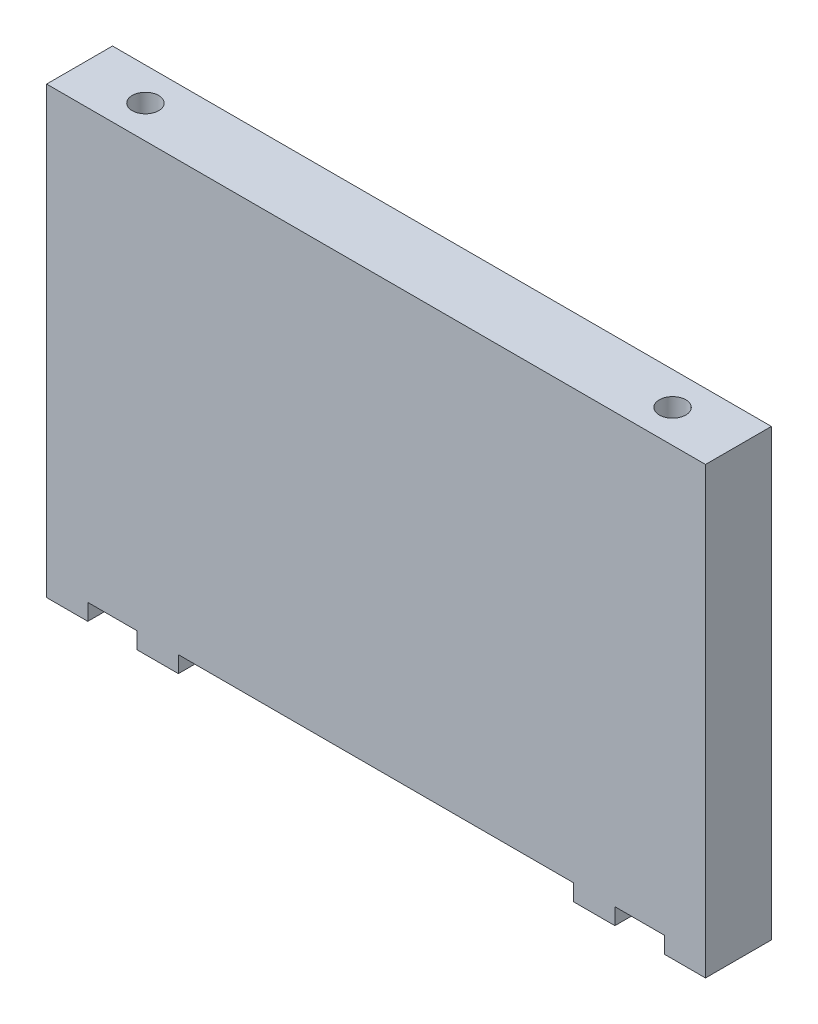
ISO-10303-21;
HEADER;
FILE_DESCRIPTION(('STEP AP214'),'2;1');
FILE_NAME('part.step','',(''),(''),'','','');
FILE_SCHEMA(('AUTOMOTIVE_DESIGN { 1 0 10303 214 1 1 1 1 }'));
ENDSEC;
DATA;
#1=APPLICATION_CONTEXT('core data for automotive mechanical design processes');
#2=APPLICATION_PROTOCOL_DEFINITION('international standard','automotive_design',2000,#1);
#3=PRODUCT_CONTEXT('',#1,'mechanical');
#4=PRODUCT('Part','Part','',(#3));
#5=PRODUCT_RELATED_PRODUCT_CATEGORY('part','',(#4));
#6=PRODUCT_DEFINITION_FORMATION('','',#4);
#7=PRODUCT_DEFINITION_CONTEXT('part definition',#1,'design');
#8=PRODUCT_DEFINITION('design','',#6,#7);
#9=PRODUCT_DEFINITION_SHAPE('','',#8);
#10=(LENGTH_UNIT() NAMED_UNIT(*) SI_UNIT(.MILLI.,.METRE.));
#11=(NAMED_UNIT(*) PLANE_ANGLE_UNIT() SI_UNIT($,.RADIAN.));
#12=(NAMED_UNIT(*) SI_UNIT($,.STERADIAN.) SOLID_ANGLE_UNIT());
#13=UNCERTAINTY_MEASURE_WITH_UNIT(LENGTH_MEASURE(1.E-05),#10,'distance_accuracy_value','');
#14=(GEOMETRIC_REPRESENTATION_CONTEXT(3) GLOBAL_UNCERTAINTY_ASSIGNED_CONTEXT((#13)) GLOBAL_UNIT_ASSIGNED_CONTEXT((#10,
#11,#12)) REPRESENTATION_CONTEXT('',''));
#15=CARTESIAN_POINT('',(0.,0.,0.));
#16=DIRECTION('',(0.,0.,1.));
#17=DIRECTION('',(1.,0.,0.));
#18=AXIS2_PLACEMENT_3D('',#15,#16,#17);
#19=CARTESIAN_POINT('',(-63.5,-42.8625,12.7));
#20=DIRECTION('',(0.,1.,0.));
#21=DIRECTION('',(0.,0.,1.));
#22=AXIS2_PLACEMENT_3D('',#19,#20,#21);
#23=PLANE('',#22);
#24=DIRECTION('',(1.,0.,0.));
#25=VECTOR('',#24,1.);
#26=CARTESIAN_POINT('',(-63.5,-42.8625,0.));
#27=LINE('',#26,#25);
#28=CARTESIAN_POINT('',(-63.5,-42.8625,0.));
#29=VERTEX_POINT('',#28);
#30=CARTESIAN_POINT('',(-55.5625,-42.8625,0.));
#31=VERTEX_POINT('',#30);
#32=EDGE_CURVE('E302',#29,#31,#27,.T.);
#33=ORIENTED_EDGE('',*,*,#32,.T.);
#34=DIRECTION('',(0.,0.,1.));
#35=VECTOR('',#34,1.);
#36=CARTESIAN_POINT('',(-55.5625,-42.8625,0.));
#37=LINE('',#36,#35);
#38=CARTESIAN_POINT('',(-55.5625,-42.8625,12.7));
#39=VERTEX_POINT('',#38);
#40=EDGE_CURVE('E214',#31,#39,#37,.T.);
#41=ORIENTED_EDGE('',*,*,#40,.T.);
#42=DIRECTION('',(1.,0.,0.));
#43=VECTOR('',#42,1.);
#44=CARTESIAN_POINT('',(-63.5,-42.8625,12.7));
#45=LINE('',#44,#43);
#46=CARTESIAN_POINT('',(-63.5,-42.8625,12.7));
#47=VERTEX_POINT('',#46);
#48=EDGE_CURVE('E289',#47,#39,#45,.T.);
#49=ORIENTED_EDGE('',*,*,#48,.F.);
#50=DIRECTION('',(0.,0.,-1.));
#51=VECTOR('',#50,1.);
#52=CARTESIAN_POINT('',(-63.5,-42.8625,12.7));
#53=LINE('',#52,#51);
#54=EDGE_CURVE('E57',#47,#29,#53,.T.);
#55=ORIENTED_EDGE('',*,*,#54,.T.);
#56=EDGE_LOOP('',(#33,#41,#49,#55));
#57=FACE_BOUND('',#56,.T.);
#58=ADVANCED_FACE('F48',(#57),#23,.F.);
#59=CARTESIAN_POINT('',(38.0999999999999,-42.8625,0.));
#60=VERTEX_POINT('',#59);
#61=CARTESIAN_POINT('',(46.0375,-42.8625,0.));
#62=VERTEX_POINT('',#61);
#63=EDGE_CURVE('E306',#60,#62,#27,.T.);
#64=ORIENTED_EDGE('',*,*,#63,.T.);
#65=DIRECTION('',(0.,0.,1.));
#66=VECTOR('',#65,1.);
#67=CARTESIAN_POINT('',(46.0375,-42.8625,0.));
#68=LINE('',#67,#66);
#69=CARTESIAN_POINT('',(46.0375,-42.8625,12.7));
#70=VERTEX_POINT('',#69);
#71=EDGE_CURVE('E238',#62,#70,#68,.T.);
#72=ORIENTED_EDGE('',*,*,#71,.T.);
#73=CARTESIAN_POINT('',(38.0999999999999,-42.8625,12.7));
#74=VERTEX_POINT('',#73);
#75=EDGE_CURVE('E294',#74,#70,#45,.T.);
#76=ORIENTED_EDGE('',*,*,#75,.F.);
#77=DIRECTION('',(0.,0.,1.));
#78=VECTOR('',#77,1.);
#79=CARTESIAN_POINT('',(38.0999999999999,-42.8625,0.));
#80=LINE('',#79,#78);
#81=EDGE_CURVE('E277',#60,#74,#80,.T.);
#82=ORIENTED_EDGE('',*,*,#81,.F.);
#83=EDGE_LOOP('',(#64,#72,#76,#82));
#84=FACE_BOUND('',#83,.T.);
#85=ADVANCED_FACE('F365',(#84),#23,.F.);
#86=CARTESIAN_POINT('',(-46.0375,-42.8625,12.7));
#87=VERTEX_POINT('',#86);
#88=CARTESIAN_POINT('',(-38.0999999999999,-42.8625,12.7));
#89=VERTEX_POINT('',#88);
#90=EDGE_CURVE('E293',#87,#89,#45,.T.);
#91=ORIENTED_EDGE('',*,*,#90,.F.);
#92=DIRECTION('',(0.,0.,1.));
#93=VECTOR('',#92,1.);
#94=CARTESIAN_POINT('',(-46.0375,-42.8625,0.));
#95=LINE('',#94,#93);
#96=CARTESIAN_POINT('',(-46.0375,-42.8625,0.));
#97=VERTEX_POINT('',#96);
#98=EDGE_CURVE('E226',#97,#87,#95,.T.);
#99=ORIENTED_EDGE('',*,*,#98,.F.);
#100=CARTESIAN_POINT('',(-38.0999999999999,-42.8625,0.));
#101=VERTEX_POINT('',#100);
#102=EDGE_CURVE('E305',#97,#101,#27,.T.);
#103=ORIENTED_EDGE('',*,*,#102,.T.);
#104=DIRECTION('',(0.,0.,1.));
#105=VECTOR('',#104,1.);
#106=CARTESIAN_POINT('',(-38.0999999999999,-42.8625,0.));
#107=LINE('',#106,#105);
#108=EDGE_CURVE('E264',#101,#89,#107,.T.);
#109=ORIENTED_EDGE('',*,*,#108,.T.);
#110=EDGE_LOOP('',(#91,#99,#103,#109));
#111=FACE_BOUND('',#110,.T.);
#112=ADVANCED_FACE('F346',(#111),#23,.F.);
#113=CARTESIAN_POINT('',(-63.5,42.8625,12.7));
#114=DIRECTION('',(0.,1.,0.));
#115=DIRECTION('',(0.,0.,1.));
#116=AXIS2_PLACEMENT_3D('',#113,#114,#115);
#117=PLANE('',#116);
#118=CARTESIAN_POINT('',(-50.8,42.8625,6.34999999999999));
#119=DIRECTION('',(0.,1.,0.));
#120=DIRECTION('',(0.,0.,1.));
#121=AXIS2_PLACEMENT_3D('',#118,#119,#120);
#122=CIRCLE('',#121,2.55269999999999);
#123=CARTESIAN_POINT('',(-50.8,42.8625,8.90269999999999));
#124=VERTEX_POINT('',#123);
#125=EDGE_CURVE('E183',#124,#124,#122,.T.);
#126=ORIENTED_EDGE('',*,*,#125,.F.);
#127=EDGE_LOOP('',(#126));
#128=FACE_BOUND('',#127,.T.);
#129=CARTESIAN_POINT('',(50.8,42.8625,6.34999999999999));
#130=DIRECTION('',(0.,1.,0.));
#131=DIRECTION('',(0.,0.,1.));
#132=AXIS2_PLACEMENT_3D('',#129,#130,#131);
#133=CIRCLE('',#132,2.55269999999999);
#134=CARTESIAN_POINT('',(50.8,42.8625,8.90269999999999));
#135=VERTEX_POINT('',#134);
#136=EDGE_CURVE('E182',#135,#135,#133,.T.);
#137=ORIENTED_EDGE('',*,*,#136,.F.);
#138=EDGE_LOOP('',(#137));
#139=FACE_BOUND('',#138,.T.);
#140=DIRECTION('',(1.,0.,0.));
#141=VECTOR('',#140,1.);
#142=CARTESIAN_POINT('',(-63.5,42.8625,0.));
#143=LINE('',#142,#141);
#144=CARTESIAN_POINT('',(-63.5,42.8625,0.));
#145=VERTEX_POINT('',#144);
#146=CARTESIAN_POINT('',(63.5,42.8625,0.));
#147=VERTEX_POINT('',#146);
#148=EDGE_CURVE('E274',#145,#147,#143,.T.);
#149=ORIENTED_EDGE('',*,*,#148,.F.);
#150=DIRECTION('',(0.,0.,-1.));
#151=VECTOR('',#150,1.);
#152=CARTESIAN_POINT('',(-63.5,42.8625,12.7));
#153=LINE('',#152,#151);
#154=CARTESIAN_POINT('',(-63.5,42.8625,12.7));
#155=VERTEX_POINT('',#154);
#156=EDGE_CURVE('E13',#155,#145,#153,.T.);
#157=ORIENTED_EDGE('',*,*,#156,.F.);
#158=DIRECTION('',(1.,0.,0.));
#159=VECTOR('',#158,1.);
#160=CARTESIAN_POINT('',(-63.5,42.8625,12.7));
#161=LINE('',#160,#159);
#162=CARTESIAN_POINT('',(63.5,42.8625,12.7));
#163=VERTEX_POINT('',#162);
#164=EDGE_CURVE('E281',#155,#163,#161,.T.);
#165=ORIENTED_EDGE('',*,*,#164,.T.);
#166=DIRECTION('',(0.,0.,-1.));
#167=VECTOR('',#166,1.);
#168=CARTESIAN_POINT('',(63.5,42.8625,12.7));
#169=LINE('',#168,#167);
#170=EDGE_CURVE('E52',#163,#147,#169,.T.);
#171=ORIENTED_EDGE('',*,*,#170,.T.);
#172=EDGE_LOOP('',(#149,#157,#165,#171));
#173=FACE_BOUND('',#172,.T.);
#174=ADVANCED_FACE('F50',(#128,#139,#173),#117,.T.);
#175=CARTESIAN_POINT('',(-63.5,42.8625,12.7));
#176=DIRECTION('',(1.,0.,0.));
#177=DIRECTION('',(0.,0.,-1.));
#178=AXIS2_PLACEMENT_3D('',#175,#176,#177);
#179=PLANE('',#178);
#180=DIRECTION('',(0.,-1.,0.));
#181=VECTOR('',#180,1.);
#182=CARTESIAN_POINT('',(-63.5,42.8625,0.));
#183=LINE('',#182,#181);
#184=EDGE_CURVE('E285',#145,#29,#183,.T.);
#185=ORIENTED_EDGE('',*,*,#184,.T.);
#186=ORIENTED_EDGE('',*,*,#54,.F.);
#187=DIRECTION('',(0.,-1.,0.));
#188=VECTOR('',#187,1.);
#189=CARTESIAN_POINT('',(-63.5,42.8625,12.7));
#190=LINE('',#189,#188);
#191=EDGE_CURVE('E292',#155,#47,#190,.T.);
#192=ORIENTED_EDGE('',*,*,#191,.F.);
#193=ORIENTED_EDGE('',*,*,#156,.T.);
#194=EDGE_LOOP('',(#185,#186,#192,#193));
#195=FACE_BOUND('',#194,.T.);
#196=ADVANCED_FACE('F326',(#195),#179,.F.);
#197=CARTESIAN_POINT('',(55.5625,-42.8625,12.7));
#198=VERTEX_POINT('',#197);
#199=CARTESIAN_POINT('',(63.5,-42.8625,12.7));
#200=VERTEX_POINT('',#199);
#201=EDGE_CURVE('E288',#198,#200,#45,.T.);
#202=ORIENTED_EDGE('',*,*,#201,.F.);
#203=DIRECTION('',(0.,0.,1.));
#204=VECTOR('',#203,1.);
#205=CARTESIAN_POINT('',(55.5625,-42.8625,0.));
#206=LINE('',#205,#204);
#207=CARTESIAN_POINT('',(55.5625,-42.8625,0.));
#208=VERTEX_POINT('',#207);
#209=EDGE_CURVE('E250',#208,#198,#206,.T.);
#210=ORIENTED_EDGE('',*,*,#209,.F.);
#211=CARTESIAN_POINT('',(63.5,-42.8625,0.));
#212=VERTEX_POINT('',#211);
#213=EDGE_CURVE('E301',#208,#212,#27,.T.);
#214=ORIENTED_EDGE('',*,*,#213,.T.);
#215=DIRECTION('',(0.,0.,-1.));
#216=VECTOR('',#215,1.);
#217=CARTESIAN_POINT('',(63.5,-42.8625,12.7));
#218=LINE('',#217,#216);
#219=EDGE_CURVE('E309',#200,#212,#218,.T.);
#220=ORIENTED_EDGE('',*,*,#219,.F.);
#221=EDGE_LOOP('',(#202,#210,#214,#220));
#222=FACE_BOUND('',#221,.T.);
#223=ADVANCED_FACE('F339',(#222),#23,.F.);
#224=CARTESIAN_POINT('',(63.5,42.8625,12.7));
#225=DIRECTION('',(1.,0.,0.));
#226=DIRECTION('',(0.,1.,0.));
#227=AXIS2_PLACEMENT_3D('',#224,#225,#226);
#228=PLANE('',#227);
#229=DIRECTION('',(0.,-1.,0.));
#230=VECTOR('',#229,1.);
#231=CARTESIAN_POINT('',(63.5,42.8625,0.));
#232=LINE('',#231,#230);
#233=EDGE_CURVE('E298',#147,#212,#232,.T.);
#234=ORIENTED_EDGE('',*,*,#233,.F.);
#235=ORIENTED_EDGE('',*,*,#170,.F.);
#236=DIRECTION('',(0.,-1.,0.));
#237=VECTOR('',#236,1.);
#238=CARTESIAN_POINT('',(63.5,42.8625,12.7));
#239=LINE('',#238,#237);
#240=EDGE_CURVE('E284',#163,#200,#239,.T.);
#241=ORIENTED_EDGE('',*,*,#240,.T.);
#242=ORIENTED_EDGE('',*,*,#219,.T.);
#243=EDGE_LOOP('',(#234,#235,#241,#242));
#244=FACE_BOUND('',#243,.T.);
#245=ADVANCED_FACE('F318',(#244),#228,.T.);
#246=CARTESIAN_POINT('',(0.,0.,12.7));
#247=DIRECTION('',(0.,0.,-1.));
#248=DIRECTION('',(-1.,0.,0.));
#249=AXIS2_PLACEMENT_3D('',#246,#247,#248);
#250=PLANE('',#249);
#251=ORIENTED_EDGE('',*,*,#48,.T.);
#252=DIRECTION('',(0.,-1.,0.));
#253=VECTOR('',#252,1.);
#254=CARTESIAN_POINT('',(-55.5625,-42.8625,12.7));
#255=LINE('',#254,#253);
#256=CARTESIAN_POINT('',(-55.5625,-39.6875,12.7));
#257=VERTEX_POINT('',#256);
#258=EDGE_CURVE('E205',#257,#39,#255,.T.);
#259=ORIENTED_EDGE('',*,*,#258,.F.);
#260=DIRECTION('',(-1.,0.,0.));
#261=VECTOR('',#260,1.);
#262=CARTESIAN_POINT('',(-55.5625,-39.6875,12.7));
#263=LINE('',#262,#261);
#264=CARTESIAN_POINT('',(-46.0375,-39.6875,12.7));
#265=VERTEX_POINT('',#264);
#266=EDGE_CURVE('E210',#265,#257,#263,.T.);
#267=ORIENTED_EDGE('',*,*,#266,.F.);
#268=DIRECTION('',(0.,1.,0.));
#269=VECTOR('',#268,1.);
#270=CARTESIAN_POINT('',(-46.0375,-42.8625,12.7));
#271=LINE('',#270,#269);
#272=EDGE_CURVE('E216',#87,#265,#271,.T.);
#273=ORIENTED_EDGE('',*,*,#272,.F.);
#274=ORIENTED_EDGE('',*,*,#90,.T.);
#275=DIRECTION('',(0.,-1.,0.));
#276=VECTOR('',#275,1.);
#277=CARTESIAN_POINT('',(-38.0999999999999,-42.8625,12.7));
#278=LINE('',#277,#276);
#279=CARTESIAN_POINT('',(-38.1000000000001,-39.6875,12.7));
#280=VERTEX_POINT('',#279);
#281=EDGE_CURVE('E247',#280,#89,#278,.T.);
#282=ORIENTED_EDGE('',*,*,#281,.F.);
#283=DIRECTION('',(-1.,0.,0.));
#284=VECTOR('',#283,1.);
#285=CARTESIAN_POINT('',(-38.1000000000001,-39.6875,12.7));
#286=LINE('',#285,#284);
#287=CARTESIAN_POINT('',(38.0999999999999,-39.6875,12.7));
#288=VERTEX_POINT('',#287);
#289=EDGE_CURVE('E258',#288,#280,#286,.T.);
#290=ORIENTED_EDGE('',*,*,#289,.F.);
#291=DIRECTION('',(0.,1.,0.));
#292=VECTOR('',#291,1.);
#293=CARTESIAN_POINT('',(38.0999999999999,-42.8625,12.7));
#294=LINE('',#293,#292);
#295=EDGE_CURVE('E267',#74,#288,#294,.T.);
#296=ORIENTED_EDGE('',*,*,#295,.F.);
#297=ORIENTED_EDGE('',*,*,#75,.T.);
#298=DIRECTION('',(0.,-1.,0.));
#299=VECTOR('',#298,1.);
#300=CARTESIAN_POINT('',(46.0375,-42.8625,12.7));
#301=LINE('',#300,#299);
#302=CARTESIAN_POINT('',(46.0375,-39.6875,12.7));
#303=VERTEX_POINT('',#302);
#304=EDGE_CURVE('E223',#303,#70,#301,.T.);
#305=ORIENTED_EDGE('',*,*,#304,.F.);
#306=DIRECTION('',(-1.,0.,0.));
#307=VECTOR('',#306,1.);
#308=CARTESIAN_POINT('',(46.0375,-39.6875,12.7));
#309=LINE('',#308,#307);
#310=CARTESIAN_POINT('',(55.5625,-39.6875,12.7));
#311=VERTEX_POINT('',#310);
#312=EDGE_CURVE('E234',#311,#303,#309,.T.);
#313=ORIENTED_EDGE('',*,*,#312,.F.);
#314=DIRECTION('',(0.,1.,0.));
#315=VECTOR('',#314,1.);
#316=CARTESIAN_POINT('',(55.5625,-42.8625,12.7));
#317=LINE('',#316,#315);
#318=EDGE_CURVE('E240',#198,#311,#317,.T.);
#319=ORIENTED_EDGE('',*,*,#318,.F.);
#320=ORIENTED_EDGE('',*,*,#201,.T.);
#321=ORIENTED_EDGE('',*,*,#240,.F.);
#322=ORIENTED_EDGE('',*,*,#164,.F.);
#323=ORIENTED_EDGE('',*,*,#191,.T.);
#324=EDGE_LOOP('',(#251,#259,#267,#273,#274,#282,#290,#296,#297,#305,#313,#319,#320,#321,#322,#323));
#325=FACE_BOUND('',#324,.T.);
#326=ADVANCED_FACE('F332',(#325),#250,.F.);
#327=CARTESIAN_POINT('',(0.,0.,0.));
#328=DIRECTION('',(0.,0.,-1.));
#329=DIRECTION('',(-1.,0.,0.));
#330=AXIS2_PLACEMENT_3D('',#327,#328,#329);
#331=PLANE('',#330);
#332=DIRECTION('',(0.,-1.,0.));
#333=VECTOR('',#332,1.);
#334=CARTESIAN_POINT('',(-55.5625,-42.8625,0.));
#335=LINE('',#334,#333);
#336=CARTESIAN_POINT('',(-55.5625,-39.6875,0.));
#337=VERTEX_POINT('',#336);
#338=EDGE_CURVE('E206',#337,#31,#335,.T.);
#339=ORIENTED_EDGE('',*,*,#338,.T.);
#340=ORIENTED_EDGE('',*,*,#32,.F.);
#341=ORIENTED_EDGE('',*,*,#184,.F.);
#342=ORIENTED_EDGE('',*,*,#148,.T.);
#343=ORIENTED_EDGE('',*,*,#233,.T.);
#344=ORIENTED_EDGE('',*,*,#213,.F.);
#345=DIRECTION('',(0.,1.,0.));
#346=VECTOR('',#345,1.);
#347=CARTESIAN_POINT('',(55.5625,-42.8625,0.));
#348=LINE('',#347,#346);
#349=CARTESIAN_POINT('',(55.5625,-39.6875,0.));
#350=VERTEX_POINT('',#349);
#351=EDGE_CURVE('E233',#208,#350,#348,.T.);
#352=ORIENTED_EDGE('',*,*,#351,.T.);
#353=DIRECTION('',(-1.,0.,0.));
#354=VECTOR('',#353,1.);
#355=CARTESIAN_POINT('',(46.0375,-39.6875,0.));
#356=LINE('',#355,#354);
#357=CARTESIAN_POINT('',(46.0375,-39.6875,0.));
#358=VERTEX_POINT('',#357);
#359=EDGE_CURVE('E73',#350,#358,#356,.T.);
#360=ORIENTED_EDGE('',*,*,#359,.T.);
#361=DIRECTION('',(0.,-1.,0.));
#362=VECTOR('',#361,1.);
#363=CARTESIAN_POINT('',(46.0375,-42.8625,0.));
#364=LINE('',#363,#362);
#365=EDGE_CURVE('E230',#358,#62,#364,.T.);
#366=ORIENTED_EDGE('',*,*,#365,.T.);
#367=ORIENTED_EDGE('',*,*,#63,.F.);
#368=DIRECTION('',(0.,1.,0.));
#369=VECTOR('',#368,1.);
#370=CARTESIAN_POINT('',(38.0999999999999,-42.8625,0.));
#371=LINE('',#370,#369);
#372=CARTESIAN_POINT('',(38.0999999999999,-39.6875,0.));
#373=VERTEX_POINT('',#372);
#374=EDGE_CURVE('E257',#60,#373,#371,.T.);
#375=ORIENTED_EDGE('',*,*,#374,.T.);
#376=DIRECTION('',(-1.,0.,0.));
#377=VECTOR('',#376,1.);
#378=CARTESIAN_POINT('',(-38.1000000000001,-39.6875,0.));
#379=LINE('',#378,#377);
#380=CARTESIAN_POINT('',(-38.1000000000001,-39.6875,0.));
#381=VERTEX_POINT('',#380);
#382=EDGE_CURVE('E261',#373,#381,#379,.T.);
#383=ORIENTED_EDGE('',*,*,#382,.T.);
#384=DIRECTION('',(0.,-1.,0.));
#385=VECTOR('',#384,1.);
#386=CARTESIAN_POINT('',(-38.0999999999999,-42.8625,0.));
#387=LINE('',#386,#385);
#388=EDGE_CURVE('E254',#381,#101,#387,.T.);
#389=ORIENTED_EDGE('',*,*,#388,.T.);
#390=ORIENTED_EDGE('',*,*,#102,.F.);
#391=DIRECTION('',(0.,1.,0.));
#392=VECTOR('',#391,1.);
#393=CARTESIAN_POINT('',(-46.0375,-42.8625,0.));
#394=LINE('',#393,#392);
#395=CARTESIAN_POINT('',(-46.0375,-39.6875,0.));
#396=VERTEX_POINT('',#395);
#397=EDGE_CURVE('E209',#97,#396,#394,.T.);
#398=ORIENTED_EDGE('',*,*,#397,.T.);
#399=DIRECTION('',(-1.,0.,0.));
#400=VECTOR('',#399,1.);
#401=CARTESIAN_POINT('',(-55.5625,-39.6875,0.));
#402=LINE('',#401,#400);
#403=EDGE_CURVE('E65',#396,#337,#402,.T.);
#404=ORIENTED_EDGE('',*,*,#403,.T.);
#405=EDGE_LOOP('',(#339,#340,#341,#342,#343,#344,#352,#360,#366,#367,#375,#383,#389,#390,#398,#404));
#406=FACE_BOUND('',#405,.T.);
#407=ADVANCED_FACE('F322',(#406),#331,.T.);
#408=CARTESIAN_POINT('',(-38.0999999999999,-42.8625,0.));
#409=DIRECTION('',(-1.,0.,0.));
#410=DIRECTION('',(0.,-1.,0.));
#411=AXIS2_PLACEMENT_3D('',#408,#409,#410);
#412=PLANE('',#411);
#413=ORIENTED_EDGE('',*,*,#281,.T.);
#414=ORIENTED_EDGE('',*,*,#108,.F.);
#415=ORIENTED_EDGE('',*,*,#388,.F.);
#416=DIRECTION('',(0.,0.,1.));
#417=VECTOR('',#416,1.);
#418=CARTESIAN_POINT('',(-38.1000000000001,-39.6875,0.));
#419=LINE('',#418,#417);
#420=EDGE_CURVE('E272',#381,#280,#419,.T.);
#421=ORIENTED_EDGE('',*,*,#420,.T.);
#422=EDGE_LOOP('',(#413,#414,#415,#421));
#423=FACE_BOUND('',#422,.T.);
#424=ADVANCED_FACE('F349',(#423),#412,.F.);
#425=CARTESIAN_POINT('',(-38.1000000000001,-39.6875,0.));
#426=DIRECTION('',(0.,1.,0.));
#427=DIRECTION('',(-1.,0.,0.));
#428=AXIS2_PLACEMENT_3D('',#425,#426,#427);
#429=PLANE('',#428);
#430=ORIENTED_EDGE('',*,*,#289,.T.);
#431=ORIENTED_EDGE('',*,*,#420,.F.);
#432=ORIENTED_EDGE('',*,*,#382,.F.);
#433=DIRECTION('',(0.,0.,1.));
#434=VECTOR('',#433,1.);
#435=CARTESIAN_POINT('',(38.0999999999999,-39.6875,0.));
#436=LINE('',#435,#434);
#437=EDGE_CURVE('E275',#373,#288,#436,.T.);
#438=ORIENTED_EDGE('',*,*,#437,.T.);
#439=EDGE_LOOP('',(#430,#431,#432,#438));
#440=FACE_BOUND('',#439,.T.);
#441=ADVANCED_FACE('F354',(#440),#429,.F.);
#442=CARTESIAN_POINT('',(38.0999999999999,-42.8625,0.));
#443=DIRECTION('',(1.,0.,0.));
#444=DIRECTION('',(0.,0.,-1.));
#445=AXIS2_PLACEMENT_3D('',#442,#443,#444);
#446=PLANE('',#445);
#447=ORIENTED_EDGE('',*,*,#295,.T.);
#448=ORIENTED_EDGE('',*,*,#437,.F.);
#449=ORIENTED_EDGE('',*,*,#374,.F.);
#450=ORIENTED_EDGE('',*,*,#81,.T.);
#451=EDGE_LOOP('',(#447,#448,#449,#450));
#452=FACE_BOUND('',#451,.T.);
#453=ADVANCED_FACE('F356',(#452),#446,.F.);
#454=CARTESIAN_POINT('',(46.0375,-42.8625,0.));
#455=DIRECTION('',(-1.,0.,0.));
#456=DIRECTION('',(0.,0.,1.));
#457=AXIS2_PLACEMENT_3D('',#454,#455,#456);
#458=PLANE('',#457);
#459=ORIENTED_EDGE('',*,*,#304,.T.);
#460=ORIENTED_EDGE('',*,*,#71,.F.);
#461=ORIENTED_EDGE('',*,*,#365,.F.);
#462=DIRECTION('',(0.,0.,1.));
#463=VECTOR('',#462,1.);
#464=CARTESIAN_POINT('',(46.0375,-39.6875,0.));
#465=LINE('',#464,#463);
#466=EDGE_CURVE('E245',#358,#303,#465,.T.);
#467=ORIENTED_EDGE('',*,*,#466,.T.);
#468=EDGE_LOOP('',(#459,#460,#461,#467));
#469=FACE_BOUND('',#468,.T.);
#470=ADVANCED_FACE('F368',(#469),#458,.F.);
#471=CARTESIAN_POINT('',(46.0375,-39.6875,0.));
#472=DIRECTION('',(0.,1.,0.));
#473=DIRECTION('',(0.,0.,1.));
#474=AXIS2_PLACEMENT_3D('',#471,#472,#473);
#475=PLANE('',#474);
#476=CARTESIAN_POINT('',(50.8,-39.6875,6.34999999999999));
#477=DIRECTION('',(0.,-1.,0.));
#478=DIRECTION('',(0.,0.,-1.));
#479=AXIS2_PLACEMENT_3D('',#476,#477,#478);
#480=CIRCLE('',#479,2.55269999999999);
#481=CARTESIAN_POINT('',(50.8,-39.6875,3.7973));
#482=VERTEX_POINT('',#481);
#483=EDGE_CURVE('E199',#482,#482,#480,.T.);
#484=ORIENTED_EDGE('',*,*,#483,.F.);
#485=EDGE_LOOP('',(#484));
#486=FACE_BOUND('',#485,.T.);
#487=ORIENTED_EDGE('',*,*,#312,.T.);
#488=ORIENTED_EDGE('',*,*,#466,.F.);
#489=ORIENTED_EDGE('',*,*,#359,.F.);
#490=DIRECTION('',(0.,0.,1.));
#491=VECTOR('',#490,1.);
#492=CARTESIAN_POINT('',(55.5625,-39.6875,0.));
#493=LINE('',#492,#491);
#494=EDGE_CURVE('E248',#350,#311,#493,.T.);
#495=ORIENTED_EDGE('',*,*,#494,.T.);
#496=EDGE_LOOP('',(#487,#488,#489,#495));
#497=FACE_BOUND('',#496,.T.);
#498=ADVANCED_FACE('F371',(#486,#497),#475,.F.);
#499=CARTESIAN_POINT('',(55.5625,-42.8625,0.));
#500=DIRECTION('',(1.,0.,0.));
#501=DIRECTION('',(0.,0.,-1.));
#502=AXIS2_PLACEMENT_3D('',#499,#500,#501);
#503=PLANE('',#502);
#504=ORIENTED_EDGE('',*,*,#318,.T.);
#505=ORIENTED_EDGE('',*,*,#494,.F.);
#506=ORIENTED_EDGE('',*,*,#351,.F.);
#507=ORIENTED_EDGE('',*,*,#209,.T.);
#508=EDGE_LOOP('',(#504,#505,#506,#507));
#509=FACE_BOUND('',#508,.T.);
#510=ADVANCED_FACE('F370',(#509),#503,.F.);
#511=CARTESIAN_POINT('',(-55.5625,-42.8625,0.));
#512=DIRECTION('',(-1.,0.,0.));
#513=DIRECTION('',(0.,0.,1.));
#514=AXIS2_PLACEMENT_3D('',#511,#512,#513);
#515=PLANE('',#514);
#516=ORIENTED_EDGE('',*,*,#258,.T.);
#517=ORIENTED_EDGE('',*,*,#40,.F.);
#518=ORIENTED_EDGE('',*,*,#338,.F.);
#519=DIRECTION('',(0.,0.,1.));
#520=VECTOR('',#519,1.);
#521=CARTESIAN_POINT('',(-55.5625,-39.6875,0.));
#522=LINE('',#521,#520);
#523=EDGE_CURVE('E221',#337,#257,#522,.T.);
#524=ORIENTED_EDGE('',*,*,#523,.T.);
#525=EDGE_LOOP('',(#516,#517,#518,#524));
#526=FACE_BOUND('',#525,.T.);
#527=ADVANCED_FACE('F379',(#526),#515,.F.);
#528=CARTESIAN_POINT('',(-55.5625,-39.6875,0.));
#529=DIRECTION('',(0.,1.,0.));
#530=DIRECTION('',(0.,0.,1.));
#531=AXIS2_PLACEMENT_3D('',#528,#529,#530);
#532=PLANE('',#531);
#533=CARTESIAN_POINT('',(-50.8,-39.6875,6.34999999999999));
#534=DIRECTION('',(0.,-1.,0.));
#535=DIRECTION('',(0.,0.,-1.));
#536=AXIS2_PLACEMENT_3D('',#533,#534,#535);
#537=CIRCLE('',#536,2.55269999999999);
#538=CARTESIAN_POINT('',(-50.8,-39.6875,3.7973));
#539=VERTEX_POINT('',#538);
#540=EDGE_CURVE('E193',#539,#539,#537,.T.);
#541=ORIENTED_EDGE('',*,*,#540,.F.);
#542=EDGE_LOOP('',(#541));
#543=FACE_BOUND('',#542,.T.);
#544=ORIENTED_EDGE('',*,*,#266,.T.);
#545=ORIENTED_EDGE('',*,*,#523,.F.);
#546=ORIENTED_EDGE('',*,*,#403,.F.);
#547=DIRECTION('',(0.,0.,1.));
#548=VECTOR('',#547,1.);
#549=CARTESIAN_POINT('',(-46.0375,-39.6875,0.));
#550=LINE('',#549,#548);
#551=EDGE_CURVE('E224',#396,#265,#550,.T.);
#552=ORIENTED_EDGE('',*,*,#551,.T.);
#553=EDGE_LOOP('',(#544,#545,#546,#552));
#554=FACE_BOUND('',#553,.T.);
#555=ADVANCED_FACE('F435',(#543,#554),#532,.F.);
#556=CARTESIAN_POINT('',(-46.0375,-42.8625,0.));
#557=DIRECTION('',(1.,0.,0.));
#558=DIRECTION('',(0.,0.,-1.));
#559=AXIS2_PLACEMENT_3D('',#556,#557,#558);
#560=PLANE('',#559);
#561=ORIENTED_EDGE('',*,*,#272,.T.);
#562=ORIENTED_EDGE('',*,*,#551,.F.);
#563=ORIENTED_EDGE('',*,*,#397,.F.);
#564=ORIENTED_EDGE('',*,*,#98,.T.);
#565=EDGE_LOOP('',(#561,#562,#563,#564));
#566=FACE_BOUND('',#565,.T.);
#567=ADVANCED_FACE('F433',(#566),#560,.F.);
#568=CARTESIAN_POINT('',(50.8,-23.1775,6.34999999999999));
#569=DIRECTION('',(0.,-1.,0.));
#570=DIRECTION('',(0.,0.,-1.));
#571=AXIS2_PLACEMENT_3D('',#568,#569,#570);
#572=CONICAL_SURFACE('',#571,2.55269999999998,1.02974425867665);
#573=CARTESIAN_POINT('',(50.8,-21.6436830978084,6.34999999999999));
#574=VERTEX_POINT('',#573);
#575=VERTEX_LOOP('',#574);
#576=FACE_BOUND('',#575,.T.);
#577=CARTESIAN_POINT('',(50.8,-23.1775,6.34999999999999));
#578=DIRECTION('',(0.,-1.,0.));
#579=DIRECTION('',(0.,0.,-1.));
#580=AXIS2_PLACEMENT_3D('',#577,#578,#579);
#581=CIRCLE('',#580,2.55269999999998);
#582=CARTESIAN_POINT('',(50.8,-23.1775,3.79730000000001));
#583=VERTEX_POINT('',#582);
#584=EDGE_CURVE('E202',#583,#583,#581,.T.);
#585=ORIENTED_EDGE('',*,*,#584,.T.);
#586=EDGE_LOOP('',(#585));
#587=FACE_BOUND('',#586,.T.);
#588=ADVANCED_FACE('F429',(#576,#587),#572,.F.);
#589=CARTESIAN_POINT('',(50.8,-39.6875,6.34999999999999));
#590=DIRECTION('',(0.,-1.,0.));
#591=DIRECTION('',(0.,0.,-1.));
#592=AXIS2_PLACEMENT_3D('',#589,#590,#591);
#593=CYLINDRICAL_SURFACE('',#592,2.55269999999999);
#594=ORIENTED_EDGE('',*,*,#584,.F.);
#595=EDGE_LOOP('',(#594));
#596=FACE_BOUND('',#595,.T.);
#597=ORIENTED_EDGE('',*,*,#483,.T.);
#598=EDGE_LOOP('',(#597));
#599=FACE_BOUND('',#598,.T.);
#600=ADVANCED_FACE('F425',(#596,#599),#593,.F.);
#601=CARTESIAN_POINT('',(-50.8,-23.1775,6.34999999999999));
#602=DIRECTION('',(0.,-1.,0.));
#603=DIRECTION('',(0.,0.,-1.));
#604=AXIS2_PLACEMENT_3D('',#601,#602,#603);
#605=CONICAL_SURFACE('',#604,2.55269999999998,1.02974425867665);
#606=CARTESIAN_POINT('',(-50.8,-21.6436830978084,6.34999999999999));
#607=VERTEX_POINT('',#606);
#608=VERTEX_LOOP('',#607);
#609=FACE_BOUND('',#608,.T.);
#610=CARTESIAN_POINT('',(-50.8,-23.1775,6.34999999999999));
#611=DIRECTION('',(0.,-1.,0.));
#612=DIRECTION('',(0.,0.,-1.));
#613=AXIS2_PLACEMENT_3D('',#610,#611,#612);
#614=CIRCLE('',#613,2.55269999999998);
#615=CARTESIAN_POINT('',(-50.8,-23.1775,3.79730000000001));
#616=VERTEX_POINT('',#615);
#617=EDGE_CURVE('E196',#616,#616,#614,.T.);
#618=ORIENTED_EDGE('',*,*,#617,.T.);
#619=EDGE_LOOP('',(#618));
#620=FACE_BOUND('',#619,.T.);
#621=ADVANCED_FACE('F421',(#609,#620),#605,.F.);
#622=CARTESIAN_POINT('',(-50.8,-39.6875,6.34999999999999));
#623=DIRECTION('',(0.,-1.,0.));
#624=DIRECTION('',(0.,0.,-1.));
#625=AXIS2_PLACEMENT_3D('',#622,#623,#624);
#626=CYLINDRICAL_SURFACE('',#625,2.55269999999999);
#627=ORIENTED_EDGE('',*,*,#617,.F.);
#628=EDGE_LOOP('',(#627));
#629=FACE_BOUND('',#628,.T.);
#630=ORIENTED_EDGE('',*,*,#540,.T.);
#631=EDGE_LOOP('',(#630));
#632=FACE_BOUND('',#631,.T.);
#633=ADVANCED_FACE('F413',(#629,#632),#626,.F.);
#634=CARTESIAN_POINT('',(50.8,26.3525,6.34999999999999));
#635=DIRECTION('',(0.,1.,0.));
#636=DIRECTION('',(0.,0.,1.));
#637=AXIS2_PLACEMENT_3D('',#634,#635,#636);
#638=CONICAL_SURFACE('',#637,2.55269999999998,1.02974425867665);
#639=CARTESIAN_POINT('',(50.8,24.8186830978084,6.34999999999999));
#640=VERTEX_POINT('',#639);
#641=VERTEX_LOOP('',#640);
#642=FACE_BOUND('',#641,.T.);
#643=CARTESIAN_POINT('',(50.8,26.3525,6.34999999999999));
#644=DIRECTION('',(0.,1.,0.));
#645=DIRECTION('',(0.,0.,1.));
#646=AXIS2_PLACEMENT_3D('',#643,#644,#645);
#647=CIRCLE('',#646,2.55269999999998);
#648=CARTESIAN_POINT('',(50.8,26.3525,8.90269999999998));
#649=VERTEX_POINT('',#648);
#650=EDGE_CURVE('E186',#649,#649,#647,.T.);
#651=ORIENTED_EDGE('',*,*,#650,.T.);
#652=EDGE_LOOP('',(#651));
#653=FACE_BOUND('',#652,.T.);
#654=ADVANCED_FACE('F407',(#642,#653),#638,.F.);
#655=CARTESIAN_POINT('',(50.8,42.8625,6.34999999999999));
#656=DIRECTION('',(0.,1.,0.));
#657=DIRECTION('',(0.,0.,1.));
#658=AXIS2_PLACEMENT_3D('',#655,#656,#657);
#659=CYLINDRICAL_SURFACE('',#658,2.55269999999999);
#660=ORIENTED_EDGE('',*,*,#650,.F.);
#661=EDGE_LOOP('',(#660));
#662=FACE_BOUND('',#661,.T.);
#663=ORIENTED_EDGE('',*,*,#136,.T.);
#664=EDGE_LOOP('',(#663));
#665=FACE_BOUND('',#664,.T.);
#666=ADVANCED_FACE('F176',(#662,#665),#659,.F.);
#667=CARTESIAN_POINT('',(-50.8,26.3525,6.34999999999999));
#668=DIRECTION('',(0.,1.,0.));
#669=DIRECTION('',(0.,0.,1.));
#670=AXIS2_PLACEMENT_3D('',#667,#668,#669);
#671=CONICAL_SURFACE('',#670,2.55269999999998,1.02974425867665);
#672=CARTESIAN_POINT('',(-50.8,24.8186830978084,6.34999999999999));
#673=VERTEX_POINT('',#672);
#674=VERTEX_LOOP('',#673);
#675=FACE_BOUND('',#674,.T.);
#676=CARTESIAN_POINT('',(-50.8,26.3525,6.34999999999999));
#677=DIRECTION('',(0.,1.,0.));
#678=DIRECTION('',(0.,0.,1.));
#679=AXIS2_PLACEMENT_3D('',#676,#677,#678);
#680=CIRCLE('',#679,2.55269999999998);
#681=CARTESIAN_POINT('',(-50.8,26.3525,8.90269999999998));
#682=VERTEX_POINT('',#681);
#683=EDGE_CURVE('E180',#682,#682,#680,.T.);
#684=ORIENTED_EDGE('',*,*,#683,.T.);
#685=EDGE_LOOP('',(#684));
#686=FACE_BOUND('',#685,.T.);
#687=ADVANCED_FACE('F172',(#675,#686),#671,.F.);
#688=CARTESIAN_POINT('',(-50.8,42.8625,6.34999999999999));
#689=DIRECTION('',(0.,1.,0.));
#690=DIRECTION('',(0.,0.,1.));
#691=AXIS2_PLACEMENT_3D('',#688,#689,#690);
#692=CYLINDRICAL_SURFACE('',#691,2.55269999999999);
#693=ORIENTED_EDGE('',*,*,#683,.F.);
#694=EDGE_LOOP('',(#693));
#695=FACE_BOUND('',#694,.T.);
#696=ORIENTED_EDGE('',*,*,#125,.T.);
#697=EDGE_LOOP('',(#696));
#698=FACE_BOUND('',#697,.T.);
#699=ADVANCED_FACE('F175',(#695,#698),#692,.F.);
#700=CLOSED_SHELL('',(#58,#85,#112,#174,#196,#223,#245,#326,#407,#424,#441,#453,#470,#498,#510,
#527,#555,#567,#588,#600,#621,#633,#654,#666,#687,#699));
#701=MANIFOLD_SOLID_BREP('B2',#700);
#702=ADVANCED_BREP_SHAPE_REPRESENTATION('',(#18,#701),#14);
#703=SHAPE_DEFINITION_REPRESENTATION(#9,#702);
ENDSEC;
END-ISO-10303-21;
